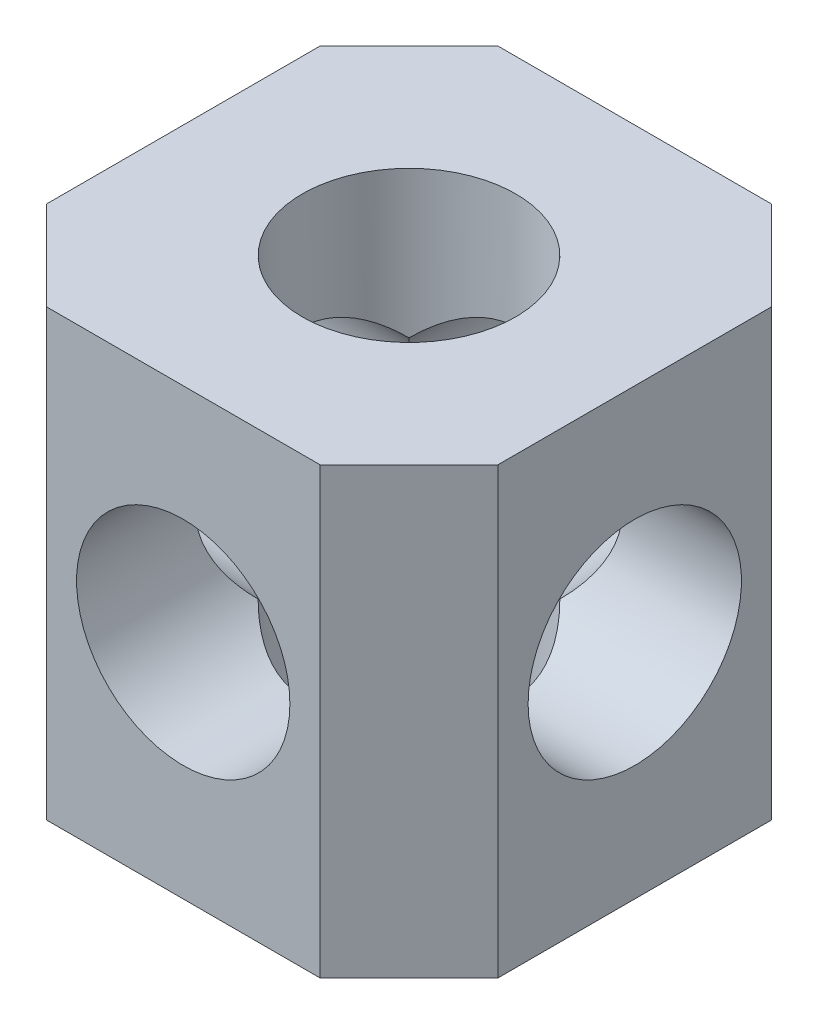
ISO-10303-21;
HEADER;
FILE_DESCRIPTION(('STEP AP214'),'2;1');
FILE_NAME('part.step','',(''),(''),'','','');
FILE_SCHEMA(('AUTOMOTIVE_DESIGN { 1 0 10303 214 1 1 1 1 }'));
ENDSEC;
DATA;
#1=APPLICATION_CONTEXT('core data for automotive mechanical design processes');
#2=APPLICATION_PROTOCOL_DEFINITION('international standard','automotive_design',2000,#1);
#3=PRODUCT_CONTEXT('',#1,'mechanical');
#4=PRODUCT('Part','Part','',(#3));
#5=PRODUCT_RELATED_PRODUCT_CATEGORY('part','',(#4));
#6=PRODUCT_DEFINITION_FORMATION('','',#4);
#7=PRODUCT_DEFINITION_CONTEXT('part definition',#1,'design');
#8=PRODUCT_DEFINITION('design','',#6,#7);
#9=PRODUCT_DEFINITION_SHAPE('','',#8);
#10=(LENGTH_UNIT() NAMED_UNIT(*) SI_UNIT(.MILLI.,.METRE.));
#11=(NAMED_UNIT(*) PLANE_ANGLE_UNIT() SI_UNIT($,.RADIAN.));
#12=(NAMED_UNIT(*) SI_UNIT($,.STERADIAN.) SOLID_ANGLE_UNIT());
#13=UNCERTAINTY_MEASURE_WITH_UNIT(LENGTH_MEASURE(1.E-05),#10,'distance_accuracy_value','');
#14=(GEOMETRIC_REPRESENTATION_CONTEXT(3) GLOBAL_UNCERTAINTY_ASSIGNED_CONTEXT((#13)) GLOBAL_UNIT_ASSIGNED_CONTEXT((#10,
#11,#12)) REPRESENTATION_CONTEXT('',''));
#15=CARTESIAN_POINT('',(0.,0.,0.));
#16=DIRECTION('',(0.,0.,1.));
#17=DIRECTION('',(1.,0.,0.));
#18=AXIS2_PLACEMENT_3D('',#15,#16,#17);
#19=CARTESIAN_POINT('',(0.,15.,0.));
#20=DIRECTION('',(0.,-1.,0.));
#21=DIRECTION('',(0.,0.,-1.));
#22=AXIS2_PLACEMENT_3D('',#19,#20,#21);
#23=CYLINDRICAL_SURFACE('',#22,6.);
#24=CARTESIAN_POINT('',(0.,7.5,0.));
#25=DIRECTION('',(-0.707106781186547,-0.707106781186547,0.));
#26=DIRECTION('',(0.707106781186547,-0.707106781186547,0.));
#27=AXIS2_PLACEMENT_3D('',#24,#25,#26);
#28=ELLIPSE('',#27,8.48528137423857,6.);
#29=CARTESIAN_POINT('',(-4.24264068711928,11.7426406871193,-4.24264068711928));
#30=VERTEX_POINT('',#29);
#31=CARTESIAN_POINT('',(-4.24264068711928,11.7426406871193,4.24264068711928));
#32=VERTEX_POINT('',#31);
#33=EDGE_CURVE('E69',#30,#32,#28,.F.);
#34=ORIENTED_EDGE('',*,*,#33,.F.);
#35=CARTESIAN_POINT('',(0.,7.5,0.));
#36=DIRECTION('',(0.,-0.707106781186547,-0.707106781186547));
#37=DIRECTION('',(0.,-0.707106781186547,0.707106781186547));
#38=AXIS2_PLACEMENT_3D('',#35,#36,#37);
#39=ELLIPSE('',#38,8.48528137423857,6.);
#40=CARTESIAN_POINT('',(4.24264068711928,11.7426406871193,-4.24264068711928));
#41=VERTEX_POINT('',#40);
#42=EDGE_CURVE('E146',#41,#30,#39,.F.);
#43=ORIENTED_EDGE('',*,*,#42,.F.);
#44=CARTESIAN_POINT('',(0.,7.5,0.));
#45=DIRECTION('',(0.707106781186547,-0.707106781186547,0.));
#46=DIRECTION('',(-0.707106781186547,-0.707106781186547,0.));
#47=AXIS2_PLACEMENT_3D('',#44,#45,#46);
#48=ELLIPSE('',#47,8.48528137423857,6.);
#49=CARTESIAN_POINT('',(4.24264068711928,11.7426406871193,4.24264068711928));
#50=VERTEX_POINT('',#49);
#51=EDGE_CURVE('E233',#50,#41,#48,.F.);
#52=ORIENTED_EDGE('',*,*,#51,.F.);
#53=CARTESIAN_POINT('',(0.,7.5,0.));
#54=DIRECTION('',(0.,-0.707106781186547,0.707106781186547));
#55=DIRECTION('',(0.,-0.707106781186547,-0.707106781186547));
#56=AXIS2_PLACEMENT_3D('',#53,#54,#55);
#57=ELLIPSE('',#56,8.48528137423857,6.);
#58=EDGE_CURVE('E282',#32,#50,#57,.F.);
#59=ORIENTED_EDGE('',*,*,#58,.F.);
#60=EDGE_LOOP('',(#34,#43,#52,#59));
#61=FACE_BOUND('',#60,.T.);
#62=CARTESIAN_POINT('',(0.,20.,0.));
#63=DIRECTION('',(0.,1.,0.));
#64=DIRECTION('',(0.,0.,1.));
#65=AXIS2_PLACEMENT_3D('',#62,#63,#64);
#66=CIRCLE('',#65,6.);
#67=CARTESIAN_POINT('',(0.,20.,6.));
#68=VERTEX_POINT('',#67);
#69=EDGE_CURVE('E167',#68,#68,#66,.T.);
#70=ORIENTED_EDGE('',*,*,#69,.T.);
#71=EDGE_LOOP('',(#70));
#72=FACE_BOUND('',#71,.T.);
#73=ADVANCED_FACE('F45',(#61,#72),#23,.F.);
#74=CARTESIAN_POINT('',(7.7,15.,-12.7));
#75=DIRECTION('',(0.,0.,1.));
#76=DIRECTION('',(1.,0.,0.));
#77=AXIS2_PLACEMENT_3D('',#74,#75,#76);
#78=PLANE('',#77);
#79=CARTESIAN_POINT('',(0.,7.5,-12.7));
#80=DIRECTION('',(0.,0.,1.));
#81=DIRECTION('',(1.,0.,0.));
#82=AXIS2_PLACEMENT_3D('',#79,#80,#81);
#83=CIRCLE('',#82,6.);
#84=CARTESIAN_POINT('',(6.,7.5,-12.7));
#85=VERTEX_POINT('',#84);
#86=EDGE_CURVE('E248',#85,#85,#83,.T.);
#87=ORIENTED_EDGE('',*,*,#86,.T.);
#88=EDGE_LOOP('',(#87));
#89=FACE_BOUND('',#88,.T.);
#90=DIRECTION('',(0.,-1.,0.));
#91=VECTOR('',#90,1.);
#92=CARTESIAN_POINT('',(7.7,15.,-12.7));
#93=LINE('',#92,#91);
#94=CARTESIAN_POINT('',(7.7,20.,-12.7));
#95=VERTEX_POINT('',#94);
#96=CARTESIAN_POINT('',(7.7,-5.,-12.7));
#97=VERTEX_POINT('',#96);
#98=EDGE_CURVE('E151',#95,#97,#93,.T.);
#99=ORIENTED_EDGE('',*,*,#98,.T.);
#100=DIRECTION('',(1.,0.,0.));
#101=VECTOR('',#100,1.);
#102=CARTESIAN_POINT('',(-7.7,-5.,-12.7));
#103=LINE('',#102,#101);
#104=CARTESIAN_POINT('',(-7.7,-5.,-12.7));
#105=VERTEX_POINT('',#104);
#106=EDGE_CURVE('E150',#105,#97,#103,.T.);
#107=ORIENTED_EDGE('',*,*,#106,.F.);
#108=DIRECTION('',(0.,-1.,0.));
#109=VECTOR('',#108,1.);
#110=CARTESIAN_POINT('',(-7.7,15.,-12.7));
#111=LINE('',#110,#109);
#112=CARTESIAN_POINT('',(-7.7,20.,-12.7));
#113=VERTEX_POINT('',#112);
#114=EDGE_CURVE('E135',#113,#105,#111,.T.);
#115=ORIENTED_EDGE('',*,*,#114,.F.);
#116=DIRECTION('',(-1.,0.,0.));
#117=VECTOR('',#116,1.);
#118=CARTESIAN_POINT('',(7.7,20.,-12.7));
#119=LINE('',#118,#117);
#120=EDGE_CURVE('E193',#95,#113,#119,.T.);
#121=ORIENTED_EDGE('',*,*,#120,.F.);
#122=EDGE_LOOP('',(#99,#107,#115,#121));
#123=FACE_BOUND('',#122,.T.);
#124=ADVANCED_FACE('F47',(#89,#123),#78,.F.);
#125=CARTESIAN_POINT('',(-7.7,15.,-12.7));
#126=DIRECTION('',(0.707106781186547,0.,0.707106781186547));
#127=DIRECTION('',(0.707106781186548,0.,-0.707106781186548));
#128=AXIS2_PLACEMENT_3D('',#125,#126,#127);
#129=PLANE('',#128);
#130=ORIENTED_EDGE('',*,*,#114,.T.);
#131=DIRECTION('',(0.707106781186548,0.,-0.707106781186548));
#132=VECTOR('',#131,1.);
#133=CARTESIAN_POINT('',(-12.7,-5.,-7.7));
#134=LINE('',#133,#132);
#135=CARTESIAN_POINT('',(-12.7,-5.,-7.7));
#136=VERTEX_POINT('',#135);
#137=EDGE_CURVE('E139',#136,#105,#134,.T.);
#138=ORIENTED_EDGE('',*,*,#137,.F.);
#139=DIRECTION('',(0.,-1.,0.));
#140=VECTOR('',#139,1.);
#141=CARTESIAN_POINT('',(-12.7,15.,-7.7));
#142=LINE('',#141,#140);
#143=CARTESIAN_POINT('',(-12.7,20.,-7.7));
#144=VERTEX_POINT('',#143);
#145=EDGE_CURVE('E147',#144,#136,#142,.T.);
#146=ORIENTED_EDGE('',*,*,#145,.F.);
#147=DIRECTION('',(-0.707106781186548,0.,0.707106781186548));
#148=VECTOR('',#147,1.);
#149=CARTESIAN_POINT('',(-7.7,20.,-12.7));
#150=LINE('',#149,#148);
#151=EDGE_CURVE('E141',#113,#144,#150,.T.);
#152=ORIENTED_EDGE('',*,*,#151,.F.);
#153=EDGE_LOOP('',(#130,#138,#146,#152));
#154=FACE_BOUND('',#153,.T.);
#155=ADVANCED_FACE('F137',(#154),#129,.F.);
#156=CARTESIAN_POINT('',(-12.7,15.,7.7));
#157=DIRECTION('',(1.,0.,0.));
#158=DIRECTION('',(0.,0.,-1.));
#159=AXIS2_PLACEMENT_3D('',#156,#157,#158);
#160=PLANE('',#159);
#161=CARTESIAN_POINT('',(-12.7,7.5,0.));
#162=DIRECTION('',(-1.,0.,0.));
#163=DIRECTION('',(0.,0.,1.));
#164=AXIS2_PLACEMENT_3D('',#161,#162,#163);
#165=CIRCLE('',#164,6.);
#166=CARTESIAN_POINT('',(-12.7,7.5,6.));
#167=VERTEX_POINT('',#166);
#168=EDGE_CURVE('E218',#167,#167,#165,.T.);
#169=ORIENTED_EDGE('',*,*,#168,.F.);
#170=EDGE_LOOP('',(#169));
#171=FACE_BOUND('',#170,.T.);
#172=ORIENTED_EDGE('',*,*,#145,.T.);
#173=DIRECTION('',(0.,0.,-1.));
#174=VECTOR('',#173,1.);
#175=CARTESIAN_POINT('',(-12.7,-5.,7.7));
#176=LINE('',#175,#174);
#177=CARTESIAN_POINT('',(-12.7,-5.,7.7));
#178=VERTEX_POINT('',#177);
#179=EDGE_CURVE('E162',#178,#136,#176,.T.);
#180=ORIENTED_EDGE('',*,*,#179,.F.);
#181=DIRECTION('',(0.,-1.,0.));
#182=VECTOR('',#181,1.);
#183=CARTESIAN_POINT('',(-12.7,15.,7.7));
#184=LINE('',#183,#182);
#185=CARTESIAN_POINT('',(-12.7,20.,7.7));
#186=VERTEX_POINT('',#185);
#187=EDGE_CURVE('E266',#186,#178,#184,.T.);
#188=ORIENTED_EDGE('',*,*,#187,.F.);
#189=DIRECTION('',(0.,0.,1.));
#190=VECTOR('',#189,1.);
#191=CARTESIAN_POINT('',(-12.7,20.,-7.7));
#192=LINE('',#191,#190);
#193=EDGE_CURVE('E198',#144,#186,#192,.T.);
#194=ORIENTED_EDGE('',*,*,#193,.F.);
#195=EDGE_LOOP('',(#172,#180,#188,#194));
#196=FACE_BOUND('',#195,.T.);
#197=ADVANCED_FACE('F350',(#171,#196),#160,.F.);
#198=CARTESIAN_POINT('',(-7.7,15.,12.7));
#199=DIRECTION('',(0.707106781186547,0.,-0.707106781186547));
#200=DIRECTION('',(-0.707106781186548,0.,-0.707106781186548));
#201=AXIS2_PLACEMENT_3D('',#198,#199,#200);
#202=PLANE('',#201);
#203=ORIENTED_EDGE('',*,*,#187,.T.);
#204=DIRECTION('',(-0.707106781186548,0.,-0.707106781186548));
#205=VECTOR('',#204,1.);
#206=CARTESIAN_POINT('',(-7.7,-5.,12.7));
#207=LINE('',#206,#205);
#208=CARTESIAN_POINT('',(-7.7,-5.,12.7));
#209=VERTEX_POINT('',#208);
#210=EDGE_CURVE('E184',#209,#178,#207,.T.);
#211=ORIENTED_EDGE('',*,*,#210,.F.);
#212=DIRECTION('',(0.,-1.,0.));
#213=VECTOR('',#212,1.);
#214=CARTESIAN_POINT('',(-7.7,15.,12.7));
#215=LINE('',#214,#213);
#216=CARTESIAN_POINT('',(-7.7,20.,12.7));
#217=VERTEX_POINT('',#216);
#218=EDGE_CURVE('E263',#217,#209,#215,.T.);
#219=ORIENTED_EDGE('',*,*,#218,.F.);
#220=DIRECTION('',(0.707106781186548,0.,0.707106781186548));
#221=VECTOR('',#220,1.);
#222=CARTESIAN_POINT('',(-12.7,20.,7.7));
#223=LINE('',#222,#221);
#224=EDGE_CURVE('E202',#186,#217,#223,.T.);
#225=ORIENTED_EDGE('',*,*,#224,.F.);
#226=EDGE_LOOP('',(#203,#211,#219,#225));
#227=FACE_BOUND('',#226,.T.);
#228=ADVANCED_FACE('F346',(#227),#202,.F.);
#229=CARTESIAN_POINT('',(7.7,15.,12.7));
#230=DIRECTION('',(0.,0.,-1.));
#231=DIRECTION('',(-1.,0.,0.));
#232=AXIS2_PLACEMENT_3D('',#229,#230,#231);
#233=PLANE('',#232);
#234=CARTESIAN_POINT('',(0.,7.5,12.7));
#235=DIRECTION('',(0.,0.,1.));
#236=DIRECTION('',(1.,0.,0.));
#237=AXIS2_PLACEMENT_3D('',#234,#235,#236);
#238=CIRCLE('',#237,6.);
#239=CARTESIAN_POINT('',(6.,7.5,12.7));
#240=VERTEX_POINT('',#239);
#241=EDGE_CURVE('E244',#240,#240,#238,.T.);
#242=ORIENTED_EDGE('',*,*,#241,.F.);
#243=EDGE_LOOP('',(#242));
#244=FACE_BOUND('',#243,.T.);
#245=ORIENTED_EDGE('',*,*,#218,.T.);
#246=DIRECTION('',(-1.,0.,0.));
#247=VECTOR('',#246,1.);
#248=CARTESIAN_POINT('',(7.7,-5.,12.7));
#249=LINE('',#248,#247);
#250=CARTESIAN_POINT('',(7.7,-5.,12.7));
#251=VERTEX_POINT('',#250);
#252=EDGE_CURVE('E180',#251,#209,#249,.T.);
#253=ORIENTED_EDGE('',*,*,#252,.F.);
#254=DIRECTION('',(0.,-1.,0.));
#255=VECTOR('',#254,1.);
#256=CARTESIAN_POINT('',(7.7,15.,12.7));
#257=LINE('',#256,#255);
#258=CARTESIAN_POINT('',(7.7,20.,12.7));
#259=VERTEX_POINT('',#258);
#260=EDGE_CURVE('E260',#259,#251,#257,.T.);
#261=ORIENTED_EDGE('',*,*,#260,.F.);
#262=DIRECTION('',(1.,0.,0.));
#263=VECTOR('',#262,1.);
#264=CARTESIAN_POINT('',(-7.7,20.,12.7));
#265=LINE('',#264,#263);
#266=EDGE_CURVE('E206',#217,#259,#265,.T.);
#267=ORIENTED_EDGE('',*,*,#266,.F.);
#268=EDGE_LOOP('',(#245,#253,#261,#267));
#269=FACE_BOUND('',#268,.T.);
#270=ADVANCED_FACE('F342',(#244,#269),#233,.F.);
#271=CARTESIAN_POINT('',(12.7,15.,7.7));
#272=DIRECTION('',(-0.707106781186547,0.,-0.707106781186547));
#273=DIRECTION('',(-0.707106781186548,0.,0.707106781186548));
#274=AXIS2_PLACEMENT_3D('',#271,#272,#273);
#275=PLANE('',#274);
#276=ORIENTED_EDGE('',*,*,#260,.T.);
#277=DIRECTION('',(-0.707106781186548,0.,0.707106781186548));
#278=VECTOR('',#277,1.);
#279=CARTESIAN_POINT('',(12.7,-5.,7.7));
#280=LINE('',#279,#278);
#281=CARTESIAN_POINT('',(12.7,-5.,7.7));
#282=VERTEX_POINT('',#281);
#283=EDGE_CURVE('E176',#282,#251,#280,.T.);
#284=ORIENTED_EDGE('',*,*,#283,.F.);
#285=DIRECTION('',(0.,-1.,0.));
#286=VECTOR('',#285,1.);
#287=CARTESIAN_POINT('',(12.7,15.,7.7));
#288=LINE('',#287,#286);
#289=CARTESIAN_POINT('',(12.7,20.,7.7));
#290=VERTEX_POINT('',#289);
#291=EDGE_CURVE('E257',#290,#282,#288,.T.);
#292=ORIENTED_EDGE('',*,*,#291,.F.);
#293=DIRECTION('',(0.707106781186548,0.,-0.707106781186548));
#294=VECTOR('',#293,1.);
#295=CARTESIAN_POINT('',(7.7,20.,12.7));
#296=LINE('',#295,#294);
#297=EDGE_CURVE('E210',#259,#290,#296,.T.);
#298=ORIENTED_EDGE('',*,*,#297,.F.);
#299=EDGE_LOOP('',(#276,#284,#292,#298));
#300=FACE_BOUND('',#299,.T.);
#301=ADVANCED_FACE('F336',(#300),#275,.F.);
#302=CARTESIAN_POINT('',(12.7,15.,7.7));
#303=DIRECTION('',(-1.,0.,0.));
#304=DIRECTION('',(0.,0.,1.));
#305=AXIS2_PLACEMENT_3D('',#302,#303,#304);
#306=PLANE('',#305);
#307=CARTESIAN_POINT('',(12.7,7.5,0.));
#308=DIRECTION('',(-1.,0.,0.));
#309=DIRECTION('',(0.,0.,1.));
#310=AXIS2_PLACEMENT_3D('',#307,#308,#309);
#311=CIRCLE('',#310,6.);
#312=CARTESIAN_POINT('',(12.7,7.5,6.));
#313=VERTEX_POINT('',#312);
#314=EDGE_CURVE('E240',#313,#313,#311,.T.);
#315=ORIENTED_EDGE('',*,*,#314,.T.);
#316=EDGE_LOOP('',(#315));
#317=FACE_BOUND('',#316,.T.);
#318=ORIENTED_EDGE('',*,*,#291,.T.);
#319=DIRECTION('',(0.,0.,1.));
#320=VECTOR('',#319,1.);
#321=CARTESIAN_POINT('',(12.7,-5.,-7.7));
#322=LINE('',#321,#320);
#323=CARTESIAN_POINT('',(12.7,-5.,-7.7));
#324=VERTEX_POINT('',#323);
#325=EDGE_CURVE('E172',#324,#282,#322,.T.);
#326=ORIENTED_EDGE('',*,*,#325,.F.);
#327=DIRECTION('',(0.,-1.,0.));
#328=VECTOR('',#327,1.);
#329=CARTESIAN_POINT('',(12.7,15.,-7.7));
#330=LINE('',#329,#328);
#331=CARTESIAN_POINT('',(12.7,20.,-7.7));
#332=VERTEX_POINT('',#331);
#333=EDGE_CURVE('E254',#332,#324,#330,.T.);
#334=ORIENTED_EDGE('',*,*,#333,.F.);
#335=DIRECTION('',(0.,0.,-1.));
#336=VECTOR('',#335,1.);
#337=CARTESIAN_POINT('',(12.7,20.,7.7));
#338=LINE('',#337,#336);
#339=EDGE_CURVE('E214',#290,#332,#338,.T.);
#340=ORIENTED_EDGE('',*,*,#339,.F.);
#341=EDGE_LOOP('',(#318,#326,#334,#340));
#342=FACE_BOUND('',#341,.T.);
#343=ADVANCED_FACE('F331',(#317,#342),#306,.F.);
#344=CARTESIAN_POINT('',(12.7,15.,-7.7));
#345=DIRECTION('',(-0.707106781186547,0.,0.707106781186547));
#346=DIRECTION('',(0.707106781186548,0.,0.707106781186548));
#347=AXIS2_PLACEMENT_3D('',#344,#345,#346);
#348=PLANE('',#347);
#349=ORIENTED_EDGE('',*,*,#333,.T.);
#350=DIRECTION('',(0.707106781186548,0.,0.707106781186548));
#351=VECTOR('',#350,1.);
#352=CARTESIAN_POINT('',(7.7,-5.,-12.7));
#353=LINE('',#352,#351);
#354=EDGE_CURVE('E156',#97,#324,#353,.T.);
#355=ORIENTED_EDGE('',*,*,#354,.F.);
#356=ORIENTED_EDGE('',*,*,#98,.F.);
#357=DIRECTION('',(-0.707106781186548,0.,-0.707106781186548));
#358=VECTOR('',#357,1.);
#359=CARTESIAN_POINT('',(12.7,20.,-7.7));
#360=LINE('',#359,#358);
#361=EDGE_CURVE('E189',#332,#95,#360,.T.);
#362=ORIENTED_EDGE('',*,*,#361,.F.);
#363=EDGE_LOOP('',(#349,#355,#356,#362));
#364=FACE_BOUND('',#363,.T.);
#365=ADVANCED_FACE('F326',(#364),#348,.F.);
#366=CARTESIAN_POINT('',(0.,7.5,0.));
#367=DIRECTION('',(-0.707106781186547,-0.707106781186547,0.));
#368=DIRECTION('',(0.707106781186547,-0.707106781186547,0.));
#369=AXIS2_PLACEMENT_3D('',#366,#367,#368);
#370=ELLIPSE('',#369,8.48528137423857,6.);
#371=CARTESIAN_POINT('',(4.24264068711928,3.25735931288072,-4.24264068711928));
#372=VERTEX_POINT('',#371);
#373=CARTESIAN_POINT('',(4.24264068711928,3.25735931288072,4.24264068711928));
#374=VERTEX_POINT('',#373);
#375=EDGE_CURVE('E62',#372,#374,#370,.T.);
#376=ORIENTED_EDGE('',*,*,#375,.F.);
#377=CARTESIAN_POINT('',(0.,7.5,0.));
#378=DIRECTION('',(0.,-0.707106781186547,0.707106781186547));
#379=DIRECTION('',(0.,-0.707106781186547,-0.707106781186547));
#380=AXIS2_PLACEMENT_3D('',#377,#378,#379);
#381=ELLIPSE('',#380,8.48528137423857,6.);
#382=CARTESIAN_POINT('',(-4.24264068711928,3.25735931288072,-4.24264068711928));
#383=VERTEX_POINT('',#382);
#384=EDGE_CURVE('E278',#383,#372,#381,.T.);
#385=ORIENTED_EDGE('',*,*,#384,.F.);
#386=CARTESIAN_POINT('',(0.,7.5,0.));
#387=DIRECTION('',(0.707106781186547,-0.707106781186547,0.));
#388=DIRECTION('',(-0.707106781186547,-0.707106781186547,0.));
#389=AXIS2_PLACEMENT_3D('',#386,#387,#388);
#390=ELLIPSE('',#389,8.48528137423857,6.);
#391=CARTESIAN_POINT('',(-4.24264068711928,3.25735931288072,4.24264068711928));
#392=VERTEX_POINT('',#391);
#393=EDGE_CURVE('E222',#392,#383,#390,.T.);
#394=ORIENTED_EDGE('',*,*,#393,.F.);
#395=CARTESIAN_POINT('',(0.,7.5,0.));
#396=DIRECTION('',(0.,-0.707106781186547,-0.707106781186547));
#397=DIRECTION('',(0.,-0.707106781186547,0.707106781186547));
#398=AXIS2_PLACEMENT_3D('',#395,#396,#397);
#399=ELLIPSE('',#398,8.48528137423857,6.);
#400=EDGE_CURVE('E274',#374,#392,#399,.T.);
#401=ORIENTED_EDGE('',*,*,#400,.F.);
#402=EDGE_LOOP('',(#376,#385,#394,#401));
#403=FACE_BOUND('',#402,.T.);
#404=CARTESIAN_POINT('',(0.,-5.,0.));
#405=DIRECTION('',(0.,-1.,0.));
#406=DIRECTION('',(0.,0.,-1.));
#407=AXIS2_PLACEMENT_3D('',#404,#405,#406);
#408=CIRCLE('',#407,6.);
#409=CARTESIAN_POINT('',(0.,-5.,-6.));
#410=VERTEX_POINT('',#409);
#411=EDGE_CURVE('E49',#410,#410,#408,.T.);
#412=ORIENTED_EDGE('',*,*,#411,.T.);
#413=EDGE_LOOP('',(#412));
#414=FACE_BOUND('',#413,.T.);
#415=ADVANCED_FACE('F304',(#403,#414),#23,.F.);
#416=CARTESIAN_POINT('',(0.,7.5,-19.3));
#417=DIRECTION('',(0.,0.,1.));
#418=DIRECTION('',(1.,0.,0.));
#419=AXIS2_PLACEMENT_3D('',#416,#417,#418);
#420=CYLINDRICAL_SURFACE('',#419,6.);
#421=ORIENTED_EDGE('',*,*,#42,.T.);
#422=CARTESIAN_POINT('',(0.,7.5,0.));
#423=DIRECTION('',(-0.707106781186547,0.,0.707106781186547));
#424=DIRECTION('',(0.707106781186547,0.,0.707106781186547));
#425=AXIS2_PLACEMENT_3D('',#422,#423,#424);
#426=ELLIPSE('',#425,8.48528137423857,6.);
#427=EDGE_CURVE('E227',#30,#383,#426,.T.);
#428=ORIENTED_EDGE('',*,*,#427,.T.);
#429=ORIENTED_EDGE('',*,*,#384,.T.);
#430=CARTESIAN_POINT('',(0.,7.5,0.));
#431=DIRECTION('',(0.707106781186547,0.,0.707106781186547));
#432=DIRECTION('',(-0.707106781186547,0.,0.707106781186547));
#433=AXIS2_PLACEMENT_3D('',#430,#431,#432);
#434=ELLIPSE('',#433,8.48528137423857,6.);
#435=EDGE_CURVE('E236',#372,#41,#434,.T.);
#436=ORIENTED_EDGE('',*,*,#435,.T.);
#437=EDGE_LOOP('',(#421,#428,#429,#436));
#438=FACE_BOUND('',#437,.T.);
#439=ORIENTED_EDGE('',*,*,#86,.F.);
#440=EDGE_LOOP('',(#439));
#441=FACE_BOUND('',#440,.T.);
#442=ADVANCED_FACE('F300',(#438,#441),#420,.F.);
#443=ORIENTED_EDGE('',*,*,#58,.T.);
#444=CARTESIAN_POINT('',(0.,7.5,0.));
#445=DIRECTION('',(-0.707106781186547,0.,0.707106781186547));
#446=DIRECTION('',(0.707106781186547,0.,0.707106781186547));
#447=AXIS2_PLACEMENT_3D('',#444,#445,#446);
#448=ELLIPSE('',#447,8.48528137423857,6.);
#449=EDGE_CURVE('E11',#50,#374,#448,.F.);
#450=ORIENTED_EDGE('',*,*,#449,.T.);
#451=ORIENTED_EDGE('',*,*,#400,.T.);
#452=CARTESIAN_POINT('',(0.,7.5,0.));
#453=DIRECTION('',(0.707106781186547,0.,0.707106781186547));
#454=DIRECTION('',(-0.707106781186547,0.,0.707106781186547));
#455=AXIS2_PLACEMENT_3D('',#452,#453,#454);
#456=ELLIPSE('',#455,8.48528137423857,6.);
#457=EDGE_CURVE('E55',#392,#32,#456,.F.);
#458=ORIENTED_EDGE('',*,*,#457,.T.);
#459=EDGE_LOOP('',(#443,#450,#451,#458));
#460=FACE_BOUND('',#459,.T.);
#461=ORIENTED_EDGE('',*,*,#241,.T.);
#462=EDGE_LOOP('',(#461));
#463=FACE_BOUND('',#462,.T.);
#464=ADVANCED_FACE('F289',(#460,#463),#420,.F.);
#465=CARTESIAN_POINT('',(19.3,7.5,0.));
#466=DIRECTION('',(-1.,0.,0.));
#467=DIRECTION('',(0.,0.,1.));
#468=AXIS2_PLACEMENT_3D('',#465,#466,#467);
#469=CYLINDRICAL_SURFACE('',#468,6.);
#470=ORIENTED_EDGE('',*,*,#168,.T.);
#471=EDGE_LOOP('',(#470));
#472=FACE_BOUND('',#471,.T.);
#473=ORIENTED_EDGE('',*,*,#33,.T.);
#474=ORIENTED_EDGE('',*,*,#457,.F.);
#475=ORIENTED_EDGE('',*,*,#393,.T.);
#476=ORIENTED_EDGE('',*,*,#427,.F.);
#477=EDGE_LOOP('',(#473,#474,#475,#476));
#478=FACE_BOUND('',#477,.T.);
#479=ADVANCED_FACE('F306',(#472,#478),#469,.F.);
#480=ORIENTED_EDGE('',*,*,#375,.T.);
#481=ORIENTED_EDGE('',*,*,#449,.F.);
#482=ORIENTED_EDGE('',*,*,#51,.T.);
#483=ORIENTED_EDGE('',*,*,#435,.F.);
#484=EDGE_LOOP('',(#480,#481,#482,#483));
#485=FACE_BOUND('',#484,.T.);
#486=ORIENTED_EDGE('',*,*,#314,.F.);
#487=EDGE_LOOP('',(#486));
#488=FACE_BOUND('',#487,.T.);
#489=ADVANCED_FACE('F297',(#485,#488),#469,.F.);
#490=CARTESIAN_POINT('',(0.,20.,0.));
#491=DIRECTION('',(0.,1.,0.));
#492=DIRECTION('',(0.,0.,1.));
#493=AXIS2_PLACEMENT_3D('',#490,#491,#492);
#494=PLANE('',#493);
#495=ORIENTED_EDGE('',*,*,#69,.F.);
#496=EDGE_LOOP('',(#495));
#497=FACE_BOUND('',#496,.T.);
#498=ORIENTED_EDGE('',*,*,#361,.T.);
#499=ORIENTED_EDGE('',*,*,#120,.T.);
#500=ORIENTED_EDGE('',*,*,#151,.T.);
#501=ORIENTED_EDGE('',*,*,#193,.T.);
#502=ORIENTED_EDGE('',*,*,#224,.T.);
#503=ORIENTED_EDGE('',*,*,#266,.T.);
#504=ORIENTED_EDGE('',*,*,#297,.T.);
#505=ORIENTED_EDGE('',*,*,#339,.T.);
#506=EDGE_LOOP('',(#498,#499,#500,#501,#502,#503,#504,#505));
#507=FACE_BOUND('',#506,.T.);
#508=ADVANCED_FACE('F314',(#497,#507),#494,.T.);
#509=CARTESIAN_POINT('',(0.,-5.,0.));
#510=DIRECTION('',(0.,-1.,0.));
#511=DIRECTION('',(0.,0.,-1.));
#512=AXIS2_PLACEMENT_3D('',#509,#510,#511);
#513=PLANE('',#512);
#514=ORIENTED_EDGE('',*,*,#411,.F.);
#515=EDGE_LOOP('',(#514));
#516=FACE_BOUND('',#515,.T.);
#517=ORIENTED_EDGE('',*,*,#137,.T.);
#518=ORIENTED_EDGE('',*,*,#106,.T.);
#519=ORIENTED_EDGE('',*,*,#354,.T.);
#520=ORIENTED_EDGE('',*,*,#325,.T.);
#521=ORIENTED_EDGE('',*,*,#283,.T.);
#522=ORIENTED_EDGE('',*,*,#252,.T.);
#523=ORIENTED_EDGE('',*,*,#210,.T.);
#524=ORIENTED_EDGE('',*,*,#179,.T.);
#525=EDGE_LOOP('',(#517,#518,#519,#520,#521,#522,#523,#524));
#526=FACE_BOUND('',#525,.T.);
#527=ADVANCED_FACE('F159',(#516,#526),#513,.T.);
#528=CLOSED_SHELL('',(#73,#124,#155,#197,#228,#270,#301,#343,#365,#415,#442,#464,#479,#489,#508,#527));
#529=MANIFOLD_SOLID_BREP('B2',#528);
#530=ADVANCED_BREP_SHAPE_REPRESENTATION('',(#18,#529),#14);
#531=SHAPE_DEFINITION_REPRESENTATION(#9,#530);
ENDSEC;
END-ISO-10303-21;
